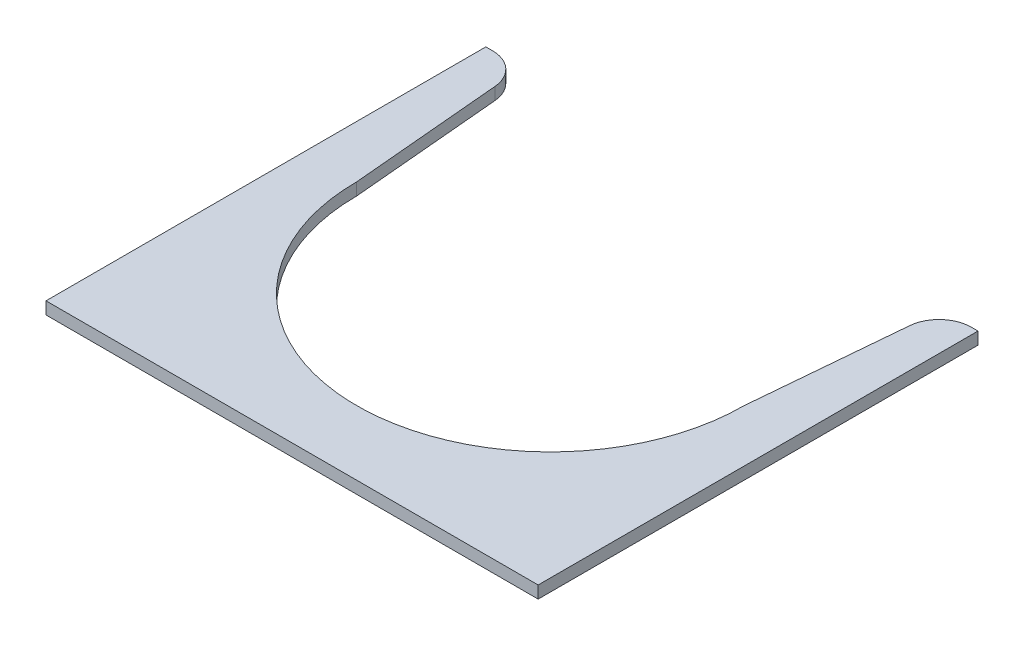
ISO-10303-21;
HEADER;
FILE_DESCRIPTION(('STEP AP214'),'2;1');
FILE_NAME('part.step','',(''),(''),'','','');
FILE_SCHEMA(('AUTOMOTIVE_DESIGN { 1 0 10303 214 1 1 1 1 }'));
ENDSEC;
DATA;
#1=APPLICATION_CONTEXT('core data for automotive mechanical design processes');
#2=APPLICATION_PROTOCOL_DEFINITION('international standard','automotive_design',2000,#1);
#3=PRODUCT_CONTEXT('',#1,'mechanical');
#4=PRODUCT('Part','Part','',(#3));
#5=PRODUCT_RELATED_PRODUCT_CATEGORY('part','',(#4));
#6=PRODUCT_DEFINITION_FORMATION('','',#4);
#7=PRODUCT_DEFINITION_CONTEXT('part definition',#1,'design');
#8=PRODUCT_DEFINITION('design','',#6,#7);
#9=PRODUCT_DEFINITION_SHAPE('','',#8);
#10=(LENGTH_UNIT() NAMED_UNIT(*) SI_UNIT(.MILLI.,.METRE.));
#11=(NAMED_UNIT(*) PLANE_ANGLE_UNIT() SI_UNIT($,.RADIAN.));
#12=(NAMED_UNIT(*) SI_UNIT($,.STERADIAN.) SOLID_ANGLE_UNIT());
#13=UNCERTAINTY_MEASURE_WITH_UNIT(LENGTH_MEASURE(1.E-05),#10,'distance_accuracy_value','');
#14=(GEOMETRIC_REPRESENTATION_CONTEXT(3) GLOBAL_UNCERTAINTY_ASSIGNED_CONTEXT((#13)) GLOBAL_UNIT_ASSIGNED_CONTEXT((#10,
#11,#12)) REPRESENTATION_CONTEXT('',''));
#15=CARTESIAN_POINT('',(0.,0.,0.));
#16=DIRECTION('',(0.,0.,1.));
#17=DIRECTION('',(1.,0.,0.));
#18=AXIS2_PLACEMENT_3D('',#15,#16,#17);
#19=CARTESIAN_POINT('',(0.,4.826,-172.974));
#20=DIRECTION('',(0.,0.,1.));
#21=DIRECTION('',(1.,0.,0.));
#22=AXIS2_PLACEMENT_3D('',#19,#20,#21);
#23=PLANE('',#22);
#24=DIRECTION('',(-1.,0.,0.));
#25=VECTOR('',#24,1.);
#26=CARTESIAN_POINT('',(0.,4.826,-172.974));
#27=LINE('',#26,#25);
#28=CARTESIAN_POINT('',(2.60373015201599,4.826,-172.974));
#29=VERTEX_POINT('',#28);
#30=CARTESIAN_POINT('',(0.,4.826,-172.974));
#31=VERTEX_POINT('',#30);
#32=EDGE_CURVE('E149',#29,#31,#27,.T.);
#33=ORIENTED_EDGE('',*,*,#32,.F.);
#34=DIRECTION('',(0.,1.,0.));
#35=VECTOR('',#34,1.);
#36=CARTESIAN_POINT('',(2.60373015201599,4.826,-172.974));
#37=LINE('',#36,#35);
#38=CARTESIAN_POINT('',(2.60373015201599,0.,-172.974));
#39=VERTEX_POINT('',#38);
#40=EDGE_CURVE('E11',#29,#39,#37,.F.);
#41=ORIENTED_EDGE('',*,*,#40,.T.);
#42=DIRECTION('',(-1.,0.,0.));
#43=VECTOR('',#42,1.);
#44=CARTESIAN_POINT('',(0.,0.,-172.974));
#45=LINE('',#44,#43);
#46=CARTESIAN_POINT('',(0.,0.,-172.974));
#47=VERTEX_POINT('',#46);
#48=EDGE_CURVE('E160',#39,#47,#45,.T.);
#49=ORIENTED_EDGE('',*,*,#48,.T.);
#50=DIRECTION('',(0.,-1.,0.));
#51=VECTOR('',#50,1.);
#52=CARTESIAN_POINT('',(0.,4.826,-172.974));
#53=LINE('',#52,#51);
#54=EDGE_CURVE('E153',#31,#47,#53,.T.);
#55=ORIENTED_EDGE('',*,*,#54,.F.);
#56=EDGE_LOOP('',(#33,#41,#49,#55));
#57=FACE_BOUND('',#56,.T.);
#58=ADVANCED_FACE('F32',(#57),#23,.F.);
#59=CARTESIAN_POINT('',(0.,4.826,0.));
#60=DIRECTION('',(1.,0.,0.));
#61=DIRECTION('',(0.,0.,-1.));
#62=AXIS2_PLACEMENT_3D('',#59,#60,#61);
#63=PLANE('',#62);
#64=DIRECTION('',(0.,0.,1.));
#65=VECTOR('',#64,1.);
#66=CARTESIAN_POINT('',(0.,0.,0.));
#67=LINE('',#66,#65);
#68=CARTESIAN_POINT('',(0.,0.,0.));
#69=VERTEX_POINT('',#68);
#70=EDGE_CURVE('E139',#47,#69,#67,.T.);
#71=ORIENTED_EDGE('',*,*,#70,.T.);
#72=DIRECTION('',(0.,-1.,0.));
#73=VECTOR('',#72,1.);
#74=CARTESIAN_POINT('',(0.,4.826,0.));
#75=LINE('',#74,#73);
#76=CARTESIAN_POINT('',(0.,4.826,0.));
#77=VERTEX_POINT('',#76);
#78=EDGE_CURVE('E171',#77,#69,#75,.T.);
#79=ORIENTED_EDGE('',*,*,#78,.F.);
#80=DIRECTION('',(0.,0.,1.));
#81=VECTOR('',#80,1.);
#82=CARTESIAN_POINT('',(0.,4.826,0.));
#83=LINE('',#82,#81);
#84=EDGE_CURVE('E141',#31,#77,#83,.T.);
#85=ORIENTED_EDGE('',*,*,#84,.F.);
#86=ORIENTED_EDGE('',*,*,#54,.T.);
#87=EDGE_LOOP('',(#71,#79,#85,#86));
#88=FACE_BOUND('',#87,.T.);
#89=ADVANCED_FACE('F211',(#88),#63,.F.);
#90=CARTESIAN_POINT('',(0.,4.826,0.));
#91=DIRECTION('',(0.,0.,-1.));
#92=DIRECTION('',(-1.,0.,0.));
#93=AXIS2_PLACEMENT_3D('',#90,#91,#92);
#94=PLANE('',#93);
#95=DIRECTION('',(1.,0.,0.));
#96=VECTOR('',#95,1.);
#97=CARTESIAN_POINT('',(0.,0.,0.));
#98=LINE('',#97,#96);
#99=CARTESIAN_POINT('',(193.548,0.,0.));
#100=VERTEX_POINT('',#99);
#101=EDGE_CURVE('E156',#69,#100,#98,.T.);
#102=ORIENTED_EDGE('',*,*,#101,.T.);
#103=DIRECTION('',(0.,-1.,0.));
#104=VECTOR('',#103,1.);
#105=CARTESIAN_POINT('',(193.548,4.826,0.));
#106=LINE('',#105,#104);
#107=CARTESIAN_POINT('',(193.548,4.826,0.));
#108=VERTEX_POINT('',#107);
#109=EDGE_CURVE('E168',#108,#100,#106,.T.);
#110=ORIENTED_EDGE('',*,*,#109,.F.);
#111=DIRECTION('',(1.,0.,0.));
#112=VECTOR('',#111,1.);
#113=CARTESIAN_POINT('',(0.,4.826,0.));
#114=LINE('',#113,#112);
#115=EDGE_CURVE('E144',#77,#108,#114,.T.);
#116=ORIENTED_EDGE('',*,*,#115,.F.);
#117=ORIENTED_EDGE('',*,*,#78,.T.);
#118=EDGE_LOOP('',(#102,#110,#116,#117));
#119=FACE_BOUND('',#118,.T.);
#120=ADVANCED_FACE('F208',(#119),#94,.F.);
#121=CARTESIAN_POINT('',(193.548,4.826,0.));
#122=DIRECTION('',(-1.,0.,0.));
#123=DIRECTION('',(0.,0.,1.));
#124=AXIS2_PLACEMENT_3D('',#121,#122,#123);
#125=PLANE('',#124);
#126=DIRECTION('',(0.,0.,-1.));
#127=VECTOR('',#126,1.);
#128=CARTESIAN_POINT('',(193.548,0.,0.));
#129=LINE('',#128,#127);
#130=CARTESIAN_POINT('',(193.548,0.,-172.974));
#131=VERTEX_POINT('',#130);
#132=EDGE_CURVE('E158',#100,#131,#129,.T.);
#133=ORIENTED_EDGE('',*,*,#132,.T.);
#134=DIRECTION('',(0.,-1.,0.));
#135=VECTOR('',#134,1.);
#136=CARTESIAN_POINT('',(193.548,4.826,-172.974));
#137=LINE('',#136,#135);
#138=CARTESIAN_POINT('',(193.548,4.826,-172.974));
#139=VERTEX_POINT('',#138);
#140=EDGE_CURVE('E165',#139,#131,#137,.T.);
#141=ORIENTED_EDGE('',*,*,#140,.F.);
#142=DIRECTION('',(0.,0.,-1.));
#143=VECTOR('',#142,1.);
#144=CARTESIAN_POINT('',(193.548,4.826,0.));
#145=LINE('',#144,#143);
#146=EDGE_CURVE('E147',#108,#139,#145,.T.);
#147=ORIENTED_EDGE('',*,*,#146,.F.);
#148=ORIENTED_EDGE('',*,*,#109,.T.);
#149=EDGE_LOOP('',(#133,#141,#147,#148));
#150=FACE_BOUND('',#149,.T.);
#151=ADVANCED_FACE('F203',(#150),#125,.F.);
#152=CARTESIAN_POINT('',(190.944269847984,0.,-172.974));
#153=VERTEX_POINT('',#152);
#154=EDGE_CURVE('E145',#131,#153,#45,.T.);
#155=ORIENTED_EDGE('',*,*,#154,.T.);
#156=DIRECTION('',(0.,1.,0.));
#157=VECTOR('',#156,1.);
#158=CARTESIAN_POINT('',(190.944269847984,4.826,-172.974));
#159=LINE('',#158,#157);
#160=CARTESIAN_POINT('',(190.944269847984,4.826,-172.974));
#161=VERTEX_POINT('',#160);
#162=EDGE_CURVE('E174',#153,#161,#159,.T.);
#163=ORIENTED_EDGE('',*,*,#162,.T.);
#164=EDGE_CURVE('E150',#139,#161,#27,.T.);
#165=ORIENTED_EDGE('',*,*,#164,.F.);
#166=ORIENTED_EDGE('',*,*,#140,.T.);
#167=EDGE_LOOP('',(#155,#163,#165,#166));
#168=FACE_BOUND('',#167,.T.);
#169=ADVANCED_FACE('F198',(#168),#23,.F.);
#170=CARTESIAN_POINT('',(0.,4.826,0.));
#171=DIRECTION('',(0.,-1.,0.));
#172=DIRECTION('',(0.,0.,-1.));
#173=AXIS2_PLACEMENT_3D('',#170,#171,#172);
#174=PLANE('',#173);
#175=ORIENTED_EDGE('',*,*,#164,.T.);
#176=CARTESIAN_POINT('',(190.944269847984,4.826,-160.274));
#177=DIRECTION('',(0.,-1.,0.));
#178=DIRECTION('',(0.,0.,-1.));
#179=AXIS2_PLACEMENT_3D('',#176,#177,#178);
#180=CIRCLE('',#179,12.7);
#181=CARTESIAN_POINT('',(178.2942355773,4.826,-161.399447888851));
#182=VERTEX_POINT('',#181);
#183=EDGE_CURVE('E179',#161,#182,#180,.F.);
#184=ORIENTED_EDGE('',*,*,#183,.T.);
#185=DIRECTION('',(0.088617944004007,0.,-0.996065690605044));
#186=VECTOR('',#185,1.);
#187=CARTESIAN_POINT('',(179.324,4.826,-172.974));
#188=LINE('',#187,#186);
#189=CARTESIAN_POINT('',(172.974,4.826,-101.6));
#190=VERTEX_POINT('',#189);
#191=EDGE_CURVE('E133',#190,#182,#188,.T.);
#192=ORIENTED_EDGE('',*,*,#191,.F.);
#193=CARTESIAN_POINT('',(96.774,4.826,-101.6));
#194=DIRECTION('',(0.,1.,0.));
#195=DIRECTION('',(0.,0.,1.));
#196=AXIS2_PLACEMENT_3D('',#193,#194,#195);
#197=CIRCLE('',#196,76.2);
#198=CARTESIAN_POINT('',(20.574,4.826,-101.6));
#199=VERTEX_POINT('',#198);
#200=EDGE_CURVE('E115',#199,#190,#197,.T.);
#201=ORIENTED_EDGE('',*,*,#200,.F.);
#202=DIRECTION('',(0.0886179440040078,0.,0.996065690605044));
#203=VECTOR('',#202,1.);
#204=CARTESIAN_POINT('',(20.574,4.826,-101.6));
#205=LINE('',#204,#203);
#206=CARTESIAN_POINT('',(15.2537644227,4.826,-161.399447888851));
#207=VERTEX_POINT('',#206);
#208=EDGE_CURVE('E131',#207,#199,#205,.T.);
#209=ORIENTED_EDGE('',*,*,#208,.F.);
#210=CARTESIAN_POINT('',(2.60373015201599,4.826,-160.274));
#211=DIRECTION('',(0.,-1.,0.));
#212=DIRECTION('',(0.,0.,-1.));
#213=AXIS2_PLACEMENT_3D('',#210,#211,#212);
#214=CIRCLE('',#213,12.7);
#215=EDGE_CURVE('E177',#207,#29,#214,.F.);
#216=ORIENTED_EDGE('',*,*,#215,.T.);
#217=ORIENTED_EDGE('',*,*,#32,.T.);
#218=ORIENTED_EDGE('',*,*,#84,.T.);
#219=ORIENTED_EDGE('',*,*,#115,.T.);
#220=ORIENTED_EDGE('',*,*,#146,.T.);
#221=EDGE_LOOP('',(#175,#184,#192,#201,#209,#216,#217,#218,#219,#220));
#222=FACE_BOUND('',#221,.T.);
#223=ADVANCED_FACE('F191',(#222),#174,.F.);
#224=CARTESIAN_POINT('',(0.,0.,0.));
#225=DIRECTION('',(0.,-1.,0.));
#226=DIRECTION('',(0.,0.,-1.));
#227=AXIS2_PLACEMENT_3D('',#224,#225,#226);
#228=PLANE('',#227);
#229=DIRECTION('',(0.088617944004007,0.,-0.996065690605044));
#230=VECTOR('',#229,1.);
#231=CARTESIAN_POINT('',(179.324,0.,-172.974));
#232=LINE('',#231,#230);
#233=CARTESIAN_POINT('',(172.974,0.,-101.6));
#234=VERTEX_POINT('',#233);
#235=CARTESIAN_POINT('',(178.2942355773,0.,-161.399447888851));
#236=VERTEX_POINT('',#235);
#237=EDGE_CURVE('E123',#234,#236,#232,.T.);
#238=ORIENTED_EDGE('',*,*,#237,.T.);
#239=CARTESIAN_POINT('',(190.944269847984,0.,-160.274));
#240=DIRECTION('',(0.,-1.,0.));
#241=DIRECTION('',(0.,0.,-1.));
#242=AXIS2_PLACEMENT_3D('',#239,#240,#241);
#243=CIRCLE('',#242,12.7);
#244=EDGE_CURVE('E183',#236,#153,#243,.T.);
#245=ORIENTED_EDGE('',*,*,#244,.T.);
#246=ORIENTED_EDGE('',*,*,#154,.F.);
#247=ORIENTED_EDGE('',*,*,#132,.F.);
#248=ORIENTED_EDGE('',*,*,#101,.F.);
#249=ORIENTED_EDGE('',*,*,#70,.F.);
#250=ORIENTED_EDGE('',*,*,#48,.F.);
#251=CARTESIAN_POINT('',(2.60373015201599,0.,-160.274));
#252=DIRECTION('',(0.,-1.,0.));
#253=DIRECTION('',(0.,0.,-1.));
#254=AXIS2_PLACEMENT_3D('',#251,#252,#253);
#255=CIRCLE('',#254,12.7);
#256=CARTESIAN_POINT('',(15.2537644227,0.,-161.399447888851));
#257=VERTEX_POINT('',#256);
#258=EDGE_CURVE('E52',#39,#257,#255,.T.);
#259=ORIENTED_EDGE('',*,*,#258,.T.);
#260=DIRECTION('',(0.0886179440040078,0.,0.996065690605044));
#261=VECTOR('',#260,1.);
#262=CARTESIAN_POINT('',(20.574,0.,-101.6));
#263=LINE('',#262,#261);
#264=CARTESIAN_POINT('',(20.574,0.,-101.6));
#265=VERTEX_POINT('',#264);
#266=EDGE_CURVE('E120',#257,#265,#263,.T.);
#267=ORIENTED_EDGE('',*,*,#266,.T.);
#268=CARTESIAN_POINT('',(96.774,0.,-101.6));
#269=DIRECTION('',(0.,1.,0.));
#270=DIRECTION('',(0.,0.,1.));
#271=AXIS2_PLACEMENT_3D('',#268,#269,#270);
#272=CIRCLE('',#271,76.2);
#273=EDGE_CURVE('E113',#265,#234,#272,.T.);
#274=ORIENTED_EDGE('',*,*,#273,.T.);
#275=EDGE_LOOP('',(#238,#245,#246,#247,#248,#249,#250,#259,#267,#274));
#276=FACE_BOUND('',#275,.T.);
#277=ADVANCED_FACE('F129',(#276),#228,.T.);
#278=CARTESIAN_POINT('',(96.774,0.,-101.6));
#279=DIRECTION('',(0.,1.,0.));
#280=DIRECTION('',(0.,0.,1.));
#281=AXIS2_PLACEMENT_3D('',#278,#279,#280);
#282=CYLINDRICAL_SURFACE('',#281,76.2);
#283=ORIENTED_EDGE('',*,*,#200,.T.);
#284=DIRECTION('',(0.,1.,0.));
#285=VECTOR('',#284,1.);
#286=CARTESIAN_POINT('',(172.974,0.,-101.6));
#287=LINE('',#286,#285);
#288=EDGE_CURVE('E108',#234,#190,#287,.T.);
#289=ORIENTED_EDGE('',*,*,#288,.F.);
#290=ORIENTED_EDGE('',*,*,#273,.F.);
#291=DIRECTION('',(0.,1.,0.));
#292=VECTOR('',#291,1.);
#293=CARTESIAN_POINT('',(20.574,0.,-101.6));
#294=LINE('',#293,#292);
#295=EDGE_CURVE('E119',#265,#199,#294,.T.);
#296=ORIENTED_EDGE('',*,*,#295,.T.);
#297=EDGE_LOOP('',(#283,#289,#290,#296));
#298=FACE_BOUND('',#297,.T.);
#299=ADVANCED_FACE('F110',(#298),#282,.F.);
#300=CARTESIAN_POINT('',(20.574,0.,-101.6));
#301=DIRECTION('',(-0.996065690605044,0.,0.0886179440040078));
#302=DIRECTION('',(0.0886179440040078,0.,0.996065690605044));
#303=AXIS2_PLACEMENT_3D('',#300,#301,#302);
#304=PLANE('',#303);
#305=ORIENTED_EDGE('',*,*,#266,.F.);
#306=DIRECTION('',(0.,1.,0.));
#307=VECTOR('',#306,1.);
#308=CARTESIAN_POINT('',(15.2537644227,0.,-161.399447888851));
#309=LINE('',#308,#307);
#310=EDGE_CURVE('E40',#257,#207,#309,.T.);
#311=ORIENTED_EDGE('',*,*,#310,.T.);
#312=ORIENTED_EDGE('',*,*,#208,.T.);
#313=ORIENTED_EDGE('',*,*,#295,.F.);
#314=EDGE_LOOP('',(#305,#311,#312,#313));
#315=FACE_BOUND('',#314,.T.);
#316=ADVANCED_FACE('F188',(#315),#304,.F.);
#317=CARTESIAN_POINT('',(179.324,0.,-172.974));
#318=DIRECTION('',(0.996065690605044,0.,0.088617944004007));
#319=DIRECTION('',(0.088617944004007,0.,-0.996065690605044));
#320=AXIS2_PLACEMENT_3D('',#317,#318,#319);
#321=PLANE('',#320);
#322=ORIENTED_EDGE('',*,*,#191,.T.);
#323=DIRECTION('',(0.,1.,0.));
#324=VECTOR('',#323,1.);
#325=CARTESIAN_POINT('',(178.2942355773,0.,-161.399447888851));
#326=LINE('',#325,#324);
#327=EDGE_CURVE('E126',#182,#236,#326,.F.);
#328=ORIENTED_EDGE('',*,*,#327,.T.);
#329=ORIENTED_EDGE('',*,*,#237,.F.);
#330=ORIENTED_EDGE('',*,*,#288,.T.);
#331=EDGE_LOOP('',(#322,#328,#329,#330));
#332=FACE_BOUND('',#331,.T.);
#333=ADVANCED_FACE('F124',(#332),#321,.F.);
#334=CARTESIAN_POINT('',(190.944269847984,4.826,-160.274));
#335=DIRECTION('',(0.,1.,0.));
#336=DIRECTION('',(0.,0.,1.));
#337=AXIS2_PLACEMENT_3D('',#334,#335,#336);
#338=CYLINDRICAL_SURFACE('',#337,12.7);
#339=ORIENTED_EDGE('',*,*,#244,.F.);
#340=ORIENTED_EDGE('',*,*,#327,.F.);
#341=ORIENTED_EDGE('',*,*,#183,.F.);
#342=ORIENTED_EDGE('',*,*,#162,.F.);
#343=EDGE_LOOP('',(#339,#340,#341,#342));
#344=FACE_BOUND('',#343,.T.);
#345=ADVANCED_FACE('F193',(#344),#338,.T.);
#346=CARTESIAN_POINT('',(2.60373015201599,0.,-160.274));
#347=DIRECTION('',(0.,1.,0.));
#348=DIRECTION('',(0.,0.,1.));
#349=AXIS2_PLACEMENT_3D('',#346,#347,#348);
#350=CYLINDRICAL_SURFACE('',#349,12.7);
#351=ORIENTED_EDGE('',*,*,#258,.F.);
#352=ORIENTED_EDGE('',*,*,#40,.F.);
#353=ORIENTED_EDGE('',*,*,#215,.F.);
#354=ORIENTED_EDGE('',*,*,#310,.F.);
#355=EDGE_LOOP('',(#351,#352,#353,#354));
#356=FACE_BOUND('',#355,.T.);
#357=ADVANCED_FACE('F34',(#356),#350,.T.);
#358=CLOSED_SHELL('',(#58,#89,#120,#151,#169,#223,#277,#299,#316,#333,#345,#357));
#359=MANIFOLD_SOLID_BREP('B2',#358);
#360=ADVANCED_BREP_SHAPE_REPRESENTATION('',(#18,#359),#14);
#361=SHAPE_DEFINITION_REPRESENTATION(#9,#360);
ENDSEC;
END-ISO-10303-21;
